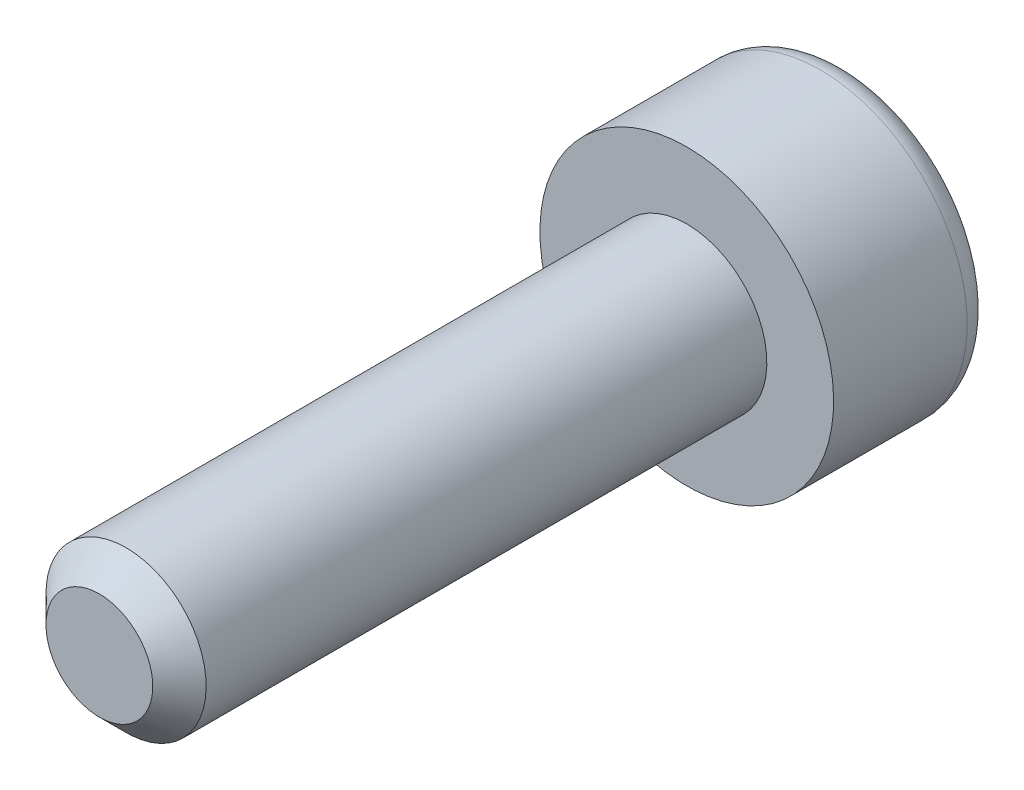
ISO-10303-21;
HEADER;
FILE_DESCRIPTION(('STEP AP214'),'2;1');
FILE_NAME('part.step','',(''),(''),'','','');
FILE_SCHEMA(('AUTOMOTIVE_DESIGN { 1 0 10303 214 1 1 1 1 }'));
ENDSEC;
DATA;
#1=APPLICATION_CONTEXT('core data for automotive mechanical design processes');
#2=APPLICATION_PROTOCOL_DEFINITION('international standard','automotive_design',2000,#1);
#3=PRODUCT_CONTEXT('',#1,'mechanical');
#4=PRODUCT('Part','Part','',(#3));
#5=PRODUCT_RELATED_PRODUCT_CATEGORY('part','',(#4));
#6=PRODUCT_DEFINITION_FORMATION('','',#4);
#7=PRODUCT_DEFINITION_CONTEXT('part definition',#1,'design');
#8=PRODUCT_DEFINITION('design','',#6,#7);
#9=PRODUCT_DEFINITION_SHAPE('','',#8);
#10=(LENGTH_UNIT() NAMED_UNIT(*) SI_UNIT(.MILLI.,.METRE.));
#11=(NAMED_UNIT(*) PLANE_ANGLE_UNIT() SI_UNIT($,.RADIAN.));
#12=(NAMED_UNIT(*) SI_UNIT($,.STERADIAN.) SOLID_ANGLE_UNIT());
#13=UNCERTAINTY_MEASURE_WITH_UNIT(LENGTH_MEASURE(1.E-05),#10,'distance_accuracy_value','');
#14=(GEOMETRIC_REPRESENTATION_CONTEXT(3) GLOBAL_UNCERTAINTY_ASSIGNED_CONTEXT((#13)) GLOBAL_UNIT_ASSIGNED_CONTEXT((#10,
#11,#12)) REPRESENTATION_CONTEXT('',''));
#15=CARTESIAN_POINT('',(0.,0.,0.));
#16=DIRECTION('',(0.,0.,1.));
#17=DIRECTION('',(1.,0.,0.));
#18=AXIS2_PLACEMENT_3D('',#15,#16,#17);
#19=CARTESIAN_POINT('',(24.6174471804571,88.4353644639025,100.060489149859));
#20=DIRECTION('',(0.,0.,1.));
#21=DIRECTION('',(1.,0.,0.));
#22=AXIS2_PLACEMENT_3D('',#19,#20,#21);
#23=PLANE('',#22);
#24=DIRECTION('',(-0.866025403784439,-0.5,0.));
#25=VECTOR('',#24,1.);
#26=CARTESIAN_POINT('',(24.6174471804571,89.8787401368765,100.060489149859));
#27=LINE('',#26,#25);
#28=CARTESIAN_POINT('',(24.6174471804571,89.8787401368765,100.060489149859));
#29=VERTEX_POINT('',#28);
#30=CARTESIAN_POINT('',(23.3674471804571,89.1570523003895,100.060489149859));
#31=VERTEX_POINT('',#30);
#32=EDGE_CURVE('E11',#29,#31,#27,.T.);
#33=ORIENTED_EDGE('',*,*,#32,.F.);
#34=DIRECTION('',(-0.866025403784439,0.5,0.));
#35=VECTOR('',#34,1.);
#36=CARTESIAN_POINT('',(25.8674471804571,89.1570523003895,100.060489149859));
#37=LINE('',#36,#35);
#38=CARTESIAN_POINT('',(25.8674471804571,89.1570523003895,100.060489149859));
#39=VERTEX_POINT('',#38);
#40=EDGE_CURVE('E130',#39,#29,#37,.T.);
#41=ORIENTED_EDGE('',*,*,#40,.F.);
#42=DIRECTION('',(0.,1.,0.));
#43=VECTOR('',#42,1.);
#44=CARTESIAN_POINT('',(25.8674471804571,87.7136766274155,100.060489149859));
#45=LINE('',#44,#43);
#46=CARTESIAN_POINT('',(25.8674471804571,87.7136766274155,100.060489149859));
#47=VERTEX_POINT('',#46);
#48=EDGE_CURVE('E161',#47,#39,#45,.T.);
#49=ORIENTED_EDGE('',*,*,#48,.F.);
#50=DIRECTION('',(0.866025403784439,0.5,0.));
#51=VECTOR('',#50,1.);
#52=CARTESIAN_POINT('',(24.6174471804571,86.9919887909285,100.060489149859));
#53=LINE('',#52,#51);
#54=CARTESIAN_POINT('',(24.6174471804571,86.9919887909285,100.060489149859));
#55=VERTEX_POINT('',#54);
#56=EDGE_CURVE('E160',#55,#47,#53,.T.);
#57=ORIENTED_EDGE('',*,*,#56,.F.);
#58=DIRECTION('',(0.866025403784439,-0.5,0.));
#59=VECTOR('',#58,1.);
#60=CARTESIAN_POINT('',(23.3674471804571,87.7136766274155,100.060489149859));
#61=LINE('',#60,#59);
#62=CARTESIAN_POINT('',(23.3674471804571,87.7136766274155,100.060489149859));
#63=VERTEX_POINT('',#62);
#64=EDGE_CURVE('E205',#63,#55,#61,.T.);
#65=ORIENTED_EDGE('',*,*,#64,.F.);
#66=DIRECTION('',(0.,-1.,0.));
#67=VECTOR('',#66,1.);
#68=CARTESIAN_POINT('',(23.3674471804571,89.1570523003895,100.060489149859));
#69=LINE('',#68,#67);
#70=EDGE_CURVE('E52',#31,#63,#69,.T.);
#71=ORIENTED_EDGE('',*,*,#70,.F.);
#72=EDGE_LOOP('',(#33,#41,#49,#57,#65,#71));
#73=FACE_BOUND('',#72,.T.);
#74=ADVANCED_FACE('F42',(#73),#23,.F.);
#75=CARTESIAN_POINT('',(23.9924471804571,89.517896218633,99.4104891498586));
#76=DIRECTION('',(-0.5,0.866025403784439,0.));
#77=DIRECTION('',(0.,0.,1.));
#78=AXIS2_PLACEMENT_3D('',#75,#76,#77);
#79=PLANE('',#78);
#80=DIRECTION('',(-0.866025403784439,-0.5,0.));
#81=VECTOR('',#80,1.);
#82=CARTESIAN_POINT('',(24.6174471804571,89.8787401368765,98.7604891498587));
#83=LINE('',#82,#81);
#84=CARTESIAN_POINT('',(24.6174471804571,89.8787401368765,98.7604891498587));
#85=VERTEX_POINT('',#84);
#86=CARTESIAN_POINT('',(23.3674471804571,89.1570523003895,98.7604891498587));
#87=VERTEX_POINT('',#86);
#88=EDGE_CURVE('E138',#85,#87,#83,.T.);
#89=ORIENTED_EDGE('',*,*,#88,.F.);
#90=DIRECTION('',(0.,0.,-1.));
#91=VECTOR('',#90,1.);
#92=CARTESIAN_POINT('',(24.6174471804571,89.8787401368765,100.060489149859));
#93=LINE('',#92,#91);
#94=EDGE_CURVE('E135',#29,#85,#93,.T.);
#95=ORIENTED_EDGE('',*,*,#94,.F.);
#96=ORIENTED_EDGE('',*,*,#32,.T.);
#97=DIRECTION('',(0.,0.,-1.));
#98=VECTOR('',#97,1.);
#99=CARTESIAN_POINT('',(23.3674471804571,89.1570523003895,100.060489149859));
#100=LINE('',#99,#98);
#101=EDGE_CURVE('E202',#31,#87,#100,.T.);
#102=ORIENTED_EDGE('',*,*,#101,.T.);
#103=EDGE_LOOP('',(#89,#95,#96,#102));
#104=FACE_BOUND('',#103,.T.);
#105=ADVANCED_FACE('F136',(#104),#79,.F.);
#106=CARTESIAN_POINT('',(23.3674471804571,88.4353644639025,99.4104891498586));
#107=DIRECTION('',(-1.,0.,0.));
#108=DIRECTION('',(0.,1.,0.));
#109=AXIS2_PLACEMENT_3D('',#106,#107,#108);
#110=PLANE('',#109);
#111=DIRECTION('',(0.,-1.,0.));
#112=VECTOR('',#111,1.);
#113=CARTESIAN_POINT('',(23.3674471804571,89.1570523003895,98.7604891498587));
#114=LINE('',#113,#112);
#115=CARTESIAN_POINT('',(23.3674471804571,87.7136766274155,98.7604891498587));
#116=VERTEX_POINT('',#115);
#117=EDGE_CURVE('E168',#87,#116,#114,.T.);
#118=ORIENTED_EDGE('',*,*,#117,.F.);
#119=ORIENTED_EDGE('',*,*,#101,.F.);
#120=ORIENTED_EDGE('',*,*,#70,.T.);
#121=DIRECTION('',(0.,0.,-1.));
#122=VECTOR('',#121,1.);
#123=CARTESIAN_POINT('',(23.3674471804571,87.7136766274155,100.060489149859));
#124=LINE('',#123,#122);
#125=EDGE_CURVE('E208',#63,#116,#124,.T.);
#126=ORIENTED_EDGE('',*,*,#125,.T.);
#127=EDGE_LOOP('',(#118,#119,#120,#126));
#128=FACE_BOUND('',#127,.T.);
#129=ADVANCED_FACE('F253',(#128),#110,.F.);
#130=CARTESIAN_POINT('',(23.9924471804571,87.352832709172,99.4104891498586));
#131=DIRECTION('',(-0.5,-0.866025403784439,0.));
#132=DIRECTION('',(-0.866025403784439,0.5,0.));
#133=AXIS2_PLACEMENT_3D('',#130,#131,#132);
#134=PLANE('',#133);
#135=DIRECTION('',(0.866025403784439,-0.5,0.));
#136=VECTOR('',#135,1.);
#137=CARTESIAN_POINT('',(23.3674471804571,87.7136766274155,98.7604891498587));
#138=LINE('',#137,#136);
#139=CARTESIAN_POINT('',(24.6174471804571,86.9919887909285,98.7604891498587));
#140=VERTEX_POINT('',#139);
#141=EDGE_CURVE('E156',#116,#140,#138,.T.);
#142=ORIENTED_EDGE('',*,*,#141,.F.);
#143=ORIENTED_EDGE('',*,*,#125,.F.);
#144=ORIENTED_EDGE('',*,*,#64,.T.);
#145=DIRECTION('',(0.,0.,-1.));
#146=VECTOR('',#145,1.);
#147=CARTESIAN_POINT('',(24.6174471804571,86.9919887909285,100.060489149859));
#148=LINE('',#147,#146);
#149=EDGE_CURVE('E158',#55,#140,#148,.T.);
#150=ORIENTED_EDGE('',*,*,#149,.T.);
#151=EDGE_LOOP('',(#142,#143,#144,#150));
#152=FACE_BOUND('',#151,.T.);
#153=ADVANCED_FACE('F44',(#152),#134,.F.);
#154=CARTESIAN_POINT('',(25.2424471804571,87.352832709172,99.4104891498586));
#155=DIRECTION('',(0.5,-0.866025403784439,0.));
#156=DIRECTION('',(0.,0.,-1.));
#157=AXIS2_PLACEMENT_3D('',#154,#155,#156);
#158=PLANE('',#157);
#159=DIRECTION('',(0.866025403784439,0.5,0.));
#160=VECTOR('',#159,1.);
#161=CARTESIAN_POINT('',(24.6174471804571,86.9919887909285,98.7604891498587));
#162=LINE('',#161,#160);
#163=CARTESIAN_POINT('',(25.8674471804571,87.7136766274155,98.7604891498587));
#164=VERTEX_POINT('',#163);
#165=EDGE_CURVE('E178',#140,#164,#162,.T.);
#166=ORIENTED_EDGE('',*,*,#165,.F.);
#167=ORIENTED_EDGE('',*,*,#149,.F.);
#168=ORIENTED_EDGE('',*,*,#56,.T.);
#169=DIRECTION('',(0.,0.,-1.));
#170=VECTOR('',#169,1.);
#171=CARTESIAN_POINT('',(25.8674471804571,87.7136766274155,100.060489149859));
#172=LINE('',#171,#170);
#173=EDGE_CURVE('E143',#47,#164,#172,.T.);
#174=ORIENTED_EDGE('',*,*,#173,.T.);
#175=EDGE_LOOP('',(#166,#167,#168,#174));
#176=FACE_BOUND('',#175,.T.);
#177=ADVANCED_FACE('F230',(#176),#158,.F.);
#178=CARTESIAN_POINT('',(25.8674471804571,88.4353644639025,99.4104891498586));
#179=DIRECTION('',(1.,0.,0.));
#180=DIRECTION('',(0.,0.,1.));
#181=AXIS2_PLACEMENT_3D('',#178,#179,#180);
#182=PLANE('',#181);
#183=DIRECTION('',(0.,1.,0.));
#184=VECTOR('',#183,1.);
#185=CARTESIAN_POINT('',(25.8674471804571,87.7136766274155,98.7604891498587));
#186=LINE('',#185,#184);
#187=CARTESIAN_POINT('',(25.8674471804571,89.1570523003895,98.7604891498587));
#188=VERTEX_POINT('',#187);
#189=EDGE_CURVE('E184',#164,#188,#186,.T.);
#190=ORIENTED_EDGE('',*,*,#189,.F.);
#191=ORIENTED_EDGE('',*,*,#173,.F.);
#192=ORIENTED_EDGE('',*,*,#48,.T.);
#193=DIRECTION('',(0.,0.,-1.));
#194=VECTOR('',#193,1.);
#195=CARTESIAN_POINT('',(25.8674471804571,89.1570523003895,100.060489149859));
#196=LINE('',#195,#194);
#197=EDGE_CURVE('E147',#39,#188,#196,.T.);
#198=ORIENTED_EDGE('',*,*,#197,.T.);
#199=EDGE_LOOP('',(#190,#191,#192,#198));
#200=FACE_BOUND('',#199,.T.);
#201=ADVANCED_FACE('F233',(#200),#182,.F.);
#202=CARTESIAN_POINT('',(25.2424471804571,89.517896218633,99.4104891498586));
#203=DIRECTION('',(0.5,0.866025403784439,0.));
#204=DIRECTION('',(0.,0.,-1.));
#205=AXIS2_PLACEMENT_3D('',#202,#203,#204);
#206=PLANE('',#205);
#207=DIRECTION('',(-0.866025403784439,0.5,0.));
#208=VECTOR('',#207,1.);
#209=CARTESIAN_POINT('',(25.8674471804571,89.1570523003895,98.7604891498587));
#210=LINE('',#209,#208);
#211=EDGE_CURVE('E169',#188,#85,#210,.T.);
#212=ORIENTED_EDGE('',*,*,#211,.F.);
#213=ORIENTED_EDGE('',*,*,#197,.F.);
#214=ORIENTED_EDGE('',*,*,#40,.T.);
#215=ORIENTED_EDGE('',*,*,#94,.T.);
#216=EDGE_LOOP('',(#212,#213,#214,#215));
#217=FACE_BOUND('',#216,.T.);
#218=ADVANCED_FACE('F145',(#217),#206,.F.);
#219=CARTESIAN_POINT('',(24.6174471804571,88.4353644639025,112.260489149859));
#220=DIRECTION('',(0.,0.,-1.));
#221=DIRECTION('',(0.,-1.,0.));
#222=AXIS2_PLACEMENT_3D('',#219,#220,#221);
#223=CONICAL_SURFACE('',#222,1.5,0.7853981625);
#224=CARTESIAN_POINT('',(24.6174471804571,88.4353644639025,112.260489149859));
#225=DIRECTION('',(0.,0.,1.));
#226=DIRECTION('',(0.,1.,0.));
#227=AXIS2_PLACEMENT_3D('',#224,#225,#226);
#228=CIRCLE('',#227,1.5);
#229=CARTESIAN_POINT('',(24.6174471804571,89.9353644639025,112.260489149859));
#230=VERTEX_POINT('',#229);
#231=EDGE_CURVE('E103',#230,#230,#228,.T.);
#232=ORIENTED_EDGE('',*,*,#231,.T.);
#233=EDGE_LOOP('',(#232));
#234=FACE_BOUND('',#233,.T.);
#235=CARTESIAN_POINT('',(24.6174471804571,88.4353644639025,112.760489149859));
#236=DIRECTION('',(0.,0.,-1.));
#237=DIRECTION('',(0.,1.,0.));
#238=AXIS2_PLACEMENT_3D('',#235,#236,#237);
#239=CIRCLE('',#238,1.);
#240=CARTESIAN_POINT('',(24.6174471804571,89.4353644639025,112.760489149859));
#241=VERTEX_POINT('',#240);
#242=EDGE_CURVE('E116',#241,#241,#239,.T.);
#243=ORIENTED_EDGE('',*,*,#242,.T.);
#244=EDGE_LOOP('',(#243));
#245=FACE_BOUND('',#244,.T.);
#246=ADVANCED_FACE('F261',(#234,#245),#223,.T.);
#247=CARTESIAN_POINT('',(24.6174471804571,88.4353644639025,117.760489149859));
#248=DIRECTION('',(0.,0.,-1.));
#249=DIRECTION('',(0.,1.,0.));
#250=AXIS2_PLACEMENT_3D('',#247,#248,#249);
#251=CYLINDRICAL_SURFACE('',#250,1.5);
#252=CARTESIAN_POINT('',(24.6174471804571,88.4353644639025,101.760489149859));
#253=DIRECTION('',(0.,0.,-1.));
#254=DIRECTION('',(0.,1.,0.));
#255=AXIS2_PLACEMENT_3D('',#252,#253,#254);
#256=CIRCLE('',#255,1.5);
#257=CARTESIAN_POINT('',(24.6174471804571,89.9353644639025,101.760489149859));
#258=VERTEX_POINT('',#257);
#259=EDGE_CURVE('E196',#258,#258,#256,.T.);
#260=ORIENTED_EDGE('',*,*,#259,.F.);
#261=EDGE_LOOP('',(#260));
#262=FACE_BOUND('',#261,.T.);
#263=ORIENTED_EDGE('',*,*,#231,.F.);
#264=EDGE_LOOP('',(#263));
#265=FACE_BOUND('',#264,.T.);
#266=ADVANCED_FACE('F277',(#262,#265),#251,.T.);
#267=CARTESIAN_POINT('',(24.6174471804571,88.4353644639025,112.760489149859));
#268=DIRECTION('',(0.,0.,1.));
#269=DIRECTION('',(1.,0.,0.));
#270=AXIS2_PLACEMENT_3D('',#267,#268,#269);
#271=PLANE('',#270);
#272=ORIENTED_EDGE('',*,*,#242,.F.);
#273=EDGE_LOOP('',(#272));
#274=FACE_BOUND('',#273,.T.);
#275=ADVANCED_FACE('F258',(#274),#271,.T.);
#276=CARTESIAN_POINT('',(24.6174471804571,88.4353644639025,99.2604891498586));
#277=DIRECTION('',(0.,0.,-1.));
#278=DIRECTION('',(0.,-1.,0.));
#279=AXIS2_PLACEMENT_3D('',#276,#277,#278);
#280=TOROIDAL_SURFACE('',#279,2.25,0.5);
#281=CARTESIAN_POINT('',(24.6174471804571,88.4353644639025,99.2604891498586));
#282=DIRECTION('',(0.,0.,-1.));
#283=DIRECTION('',(0.,-1.,0.));
#284=AXIS2_PLACEMENT_3D('',#281,#282,#283);
#285=CIRCLE('',#284,2.75);
#286=CARTESIAN_POINT('',(24.6174471804571,85.6853644639025,99.2604891498586));
#287=VERTEX_POINT('',#286);
#288=EDGE_CURVE('E162',#287,#287,#285,.T.);
#289=ORIENTED_EDGE('',*,*,#288,.T.);
#290=EDGE_LOOP('',(#289));
#291=FACE_BOUND('',#290,.T.);
#292=CARTESIAN_POINT('',(24.6174471804571,88.4353644639025,98.7604891498587));
#293=DIRECTION('',(0.,0.,1.));
#294=DIRECTION('',(0.,-1.,0.));
#295=AXIS2_PLACEMENT_3D('',#292,#293,#294);
#296=CIRCLE('',#295,2.25);
#297=CARTESIAN_POINT('',(24.6174471804571,86.1853644639025,98.7604891498587));
#298=VERTEX_POINT('',#297);
#299=EDGE_CURVE('E191',#298,#298,#296,.T.);
#300=ORIENTED_EDGE('',*,*,#299,.T.);
#301=EDGE_LOOP('',(#300));
#302=FACE_BOUND('',#301,.T.);
#303=ADVANCED_FACE('F255',(#291,#302),#280,.T.);
#304=CARTESIAN_POINT('',(24.6174471804571,88.4353644639025,101.760489149859));
#305=DIRECTION('',(0.,0.,-1.));
#306=DIRECTION('',(0.,1.,0.));
#307=AXIS2_PLACEMENT_3D('',#304,#305,#306);
#308=CYLINDRICAL_SURFACE('',#307,2.75);
#309=CARTESIAN_POINT('',(24.6174471804571,88.4353644639025,101.760489149859));
#310=DIRECTION('',(0.,0.,1.));
#311=DIRECTION('',(0.,1.,0.));
#312=AXIS2_PLACEMENT_3D('',#309,#310,#311);
#313=CIRCLE('',#312,2.75);
#314=CARTESIAN_POINT('',(24.6174471804571,91.1853644639025,101.760489149859));
#315=VERTEX_POINT('',#314);
#316=EDGE_CURVE('E165',#315,#315,#313,.T.);
#317=ORIENTED_EDGE('',*,*,#316,.F.);
#318=EDGE_LOOP('',(#317));
#319=FACE_BOUND('',#318,.T.);
#320=ORIENTED_EDGE('',*,*,#288,.F.);
#321=EDGE_LOOP('',(#320));
#322=FACE_BOUND('',#321,.T.);
#323=ADVANCED_FACE('F243',(#319,#322),#308,.T.);
#324=CARTESIAN_POINT('',(24.6174471804571,88.4353644639025,101.760489149859));
#325=DIRECTION('',(0.,0.,1.));
#326=DIRECTION('',(1.,0.,0.));
#327=AXIS2_PLACEMENT_3D('',#324,#325,#326);
#328=PLANE('',#327);
#329=ORIENTED_EDGE('',*,*,#316,.T.);
#330=EDGE_LOOP('',(#329));
#331=FACE_BOUND('',#330,.T.);
#332=ORIENTED_EDGE('',*,*,#259,.T.);
#333=EDGE_LOOP('',(#332));
#334=FACE_BOUND('',#333,.T.);
#335=ADVANCED_FACE('F237',(#331,#334),#328,.T.);
#336=CARTESIAN_POINT('',(24.6174471804571,88.4353644639025,98.7604891498587));
#337=DIRECTION('',(0.,0.,-1.));
#338=DIRECTION('',(0.,-1.,0.));
#339=AXIS2_PLACEMENT_3D('',#336,#337,#338);
#340=PLANE('',#339);
#341=ORIENTED_EDGE('',*,*,#299,.F.);
#342=EDGE_LOOP('',(#341));
#343=FACE_BOUND('',#342,.T.);
#344=ORIENTED_EDGE('',*,*,#211,.T.);
#345=ORIENTED_EDGE('',*,*,#88,.T.);
#346=ORIENTED_EDGE('',*,*,#117,.T.);
#347=ORIENTED_EDGE('',*,*,#141,.T.);
#348=ORIENTED_EDGE('',*,*,#165,.T.);
#349=ORIENTED_EDGE('',*,*,#189,.T.);
#350=EDGE_LOOP('',(#344,#345,#346,#347,#348,#349));
#351=FACE_BOUND('',#350,.T.);
#352=ADVANCED_FACE('F234',(#343,#351),#340,.T.);
#353=CLOSED_SHELL('',(#74,#105,#129,#153,#177,#201,#218,#246,#266,#275,#303,#323,#335,#352));
#354=MANIFOLD_SOLID_BREP('B2',#353);
#355=ADVANCED_BREP_SHAPE_REPRESENTATION('',(#18,#354),#14);
#356=SHAPE_DEFINITION_REPRESENTATION(#9,#355);
ENDSEC;
END-ISO-10303-21;
